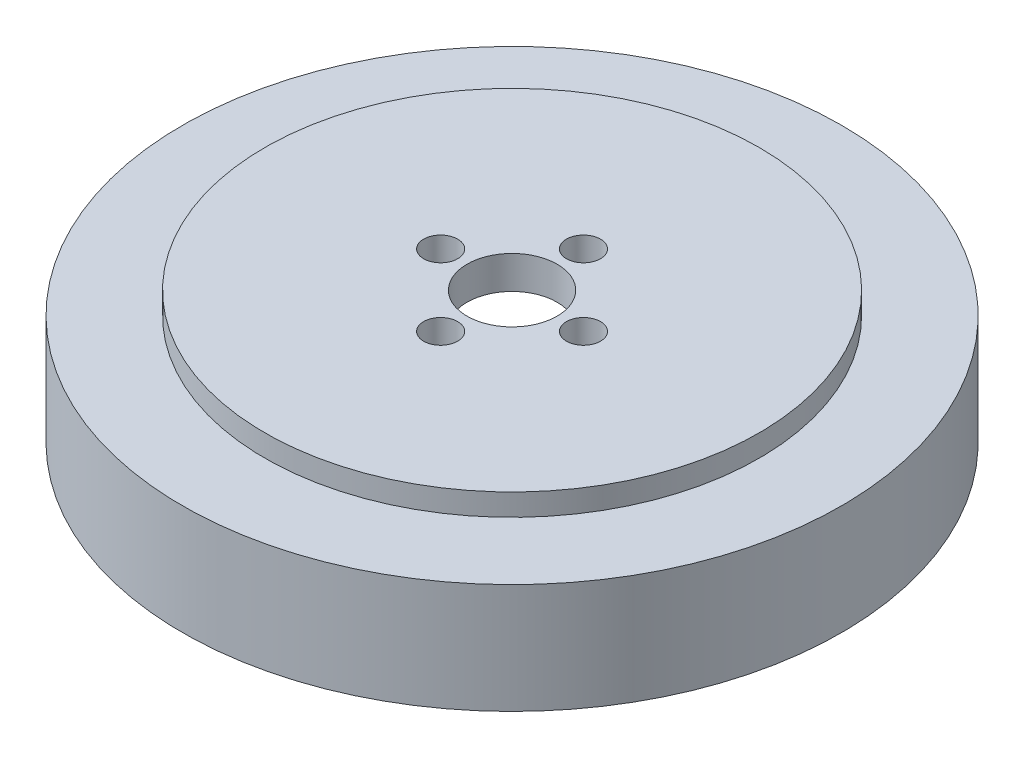
ISO-10303-21;
HEADER;
FILE_DESCRIPTION(('STEP AP214'),'2;1');
FILE_NAME('part.step','',(''),(''),'','','');
FILE_SCHEMA(('AUTOMOTIVE_DESIGN { 1 0 10303 214 1 1 1 1 }'));
ENDSEC;
DATA;
#1=APPLICATION_CONTEXT('core data for automotive mechanical design processes');
#2=APPLICATION_PROTOCOL_DEFINITION('international standard','automotive_design',2000,#1);
#3=PRODUCT_CONTEXT('',#1,'mechanical');
#4=PRODUCT('Part','Part','',(#3));
#5=PRODUCT_RELATED_PRODUCT_CATEGORY('part','',(#4));
#6=PRODUCT_DEFINITION_FORMATION('','',#4);
#7=PRODUCT_DEFINITION_CONTEXT('part definition',#1,'design');
#8=PRODUCT_DEFINITION('design','',#6,#7);
#9=PRODUCT_DEFINITION_SHAPE('','',#8);
#10=(LENGTH_UNIT() NAMED_UNIT(*) SI_UNIT(.MILLI.,.METRE.));
#11=(NAMED_UNIT(*) PLANE_ANGLE_UNIT() SI_UNIT($,.RADIAN.));
#12=(NAMED_UNIT(*) SI_UNIT($,.STERADIAN.) SOLID_ANGLE_UNIT());
#13=UNCERTAINTY_MEASURE_WITH_UNIT(LENGTH_MEASURE(1.E-05),#10,'distance_accuracy_value','');
#14=(GEOMETRIC_REPRESENTATION_CONTEXT(3) GLOBAL_UNCERTAINTY_ASSIGNED_CONTEXT((#13)) GLOBAL_UNIT_ASSIGNED_CONTEXT((#10,
#11,#12)) REPRESENTATION_CONTEXT('',''));
#15=CARTESIAN_POINT('',(0.,0.,0.));
#16=DIRECTION('',(0.,0.,1.));
#17=DIRECTION('',(1.,0.,0.));
#18=AXIS2_PLACEMENT_3D('',#15,#16,#17);
#19=CARTESIAN_POINT('',(0.,0.,0.));
#20=DIRECTION('',(0.,-1.,0.));
#21=DIRECTION('',(0.,0.,-1.));
#22=AXIS2_PLACEMENT_3D('',#19,#20,#21);
#23=CYLINDRICAL_SURFACE('',#22,22.5);
#24=CARTESIAN_POINT('',(0.,-9.00000000000001,0.));
#25=DIRECTION('',(0.,-1.,0.));
#26=DIRECTION('',(0.,0.,-1.));
#27=AXIS2_PLACEMENT_3D('',#24,#25,#26);
#28=CIRCLE('',#27,22.5);
#29=CARTESIAN_POINT('',(0.,-9.00000000000001,-22.5));
#30=VERTEX_POINT('',#29);
#31=EDGE_CURVE('E11',#30,#30,#28,.T.);
#32=ORIENTED_EDGE('',*,*,#31,.T.);
#33=EDGE_LOOP('',(#32));
#34=FACE_BOUND('',#33,.T.);
#35=CARTESIAN_POINT('',(0.,0.999999999999997,0.));
#36=DIRECTION('',(0.,-1.,0.));
#37=DIRECTION('',(0.,0.,-1.));
#38=AXIS2_PLACEMENT_3D('',#35,#36,#37);
#39=CIRCLE('',#38,22.5);
#40=CARTESIAN_POINT('',(0.,0.999999999999997,-22.5));
#41=VERTEX_POINT('',#40);
#42=EDGE_CURVE('E56',#41,#41,#39,.T.);
#43=ORIENTED_EDGE('',*,*,#42,.F.);
#44=EDGE_LOOP('',(#43));
#45=FACE_BOUND('',#44,.T.);
#46=ADVANCED_FACE('F42',(#34,#45),#23,.F.);
#47=CARTESIAN_POINT('',(22.5,-9.00000000000001,0.));
#48=DIRECTION('',(0.,-1.,0.));
#49=DIRECTION('',(0.,0.,-1.));
#50=AXIS2_PLACEMENT_3D('',#47,#48,#49);
#51=PLANE('',#50);
#52=CARTESIAN_POINT('',(0.,-9.,0.));
#53=DIRECTION('',(0.,-1.,0.));
#54=DIRECTION('',(0.,0.,-1.));
#55=AXIS2_PLACEMENT_3D('',#52,#53,#54);
#56=CIRCLE('',#55,30.);
#57=CARTESIAN_POINT('',(0.,-9.,-30.));
#58=VERTEX_POINT('',#57);
#59=EDGE_CURVE('E48',#58,#58,#56,.T.);
#60=ORIENTED_EDGE('',*,*,#59,.T.);
#61=EDGE_LOOP('',(#60));
#62=FACE_BOUND('',#61,.T.);
#63=ORIENTED_EDGE('',*,*,#31,.F.);
#64=EDGE_LOOP('',(#63));
#65=FACE_BOUND('',#64,.T.);
#66=ADVANCED_FACE('F66',(#62,#65),#51,.T.);
#67=CARTESIAN_POINT('',(0.,0.,0.));
#68=DIRECTION('',(0.,-1.,0.));
#69=DIRECTION('',(0.,0.,-1.));
#70=AXIS2_PLACEMENT_3D('',#67,#68,#69);
#71=CYLINDRICAL_SURFACE('',#70,30.);
#72=CARTESIAN_POINT('',(0.,0.999999999999997,0.));
#73=DIRECTION('',(0.,-1.,0.));
#74=DIRECTION('',(0.,0.,-1.));
#75=AXIS2_PLACEMENT_3D('',#72,#73,#74);
#76=CIRCLE('',#75,30.);
#77=CARTESIAN_POINT('',(0.,0.999999999999997,-30.));
#78=VERTEX_POINT('',#77);
#79=EDGE_CURVE('E52',#78,#78,#76,.T.);
#80=ORIENTED_EDGE('',*,*,#79,.T.);
#81=EDGE_LOOP('',(#80));
#82=FACE_BOUND('',#81,.T.);
#83=ORIENTED_EDGE('',*,*,#59,.F.);
#84=EDGE_LOOP('',(#83));
#85=FACE_BOUND('',#84,.T.);
#86=ADVANCED_FACE('F70',(#82,#85),#71,.T.);
#87=CARTESIAN_POINT('',(22.5,0.999999999999997,0.));
#88=DIRECTION('',(0.,1.,0.));
#89=DIRECTION('',(0.,0.,1.));
#90=AXIS2_PLACEMENT_3D('',#87,#88,#89);
#91=PLANE('',#90);
#92=ORIENTED_EDGE('',*,*,#42,.T.);
#93=EDGE_LOOP('',(#92));
#94=FACE_BOUND('',#93,.T.);
#95=ORIENTED_EDGE('',*,*,#79,.F.);
#96=EDGE_LOOP('',(#95));
#97=FACE_BOUND('',#96,.T.);
#98=ADVANCED_FACE('F62',(#94,#97),#91,.T.);
#99=CLOSED_SHELL('',(#46,#66,#86,#98));
#100=MANIFOLD_SOLID_BREP('B2',#99);
#101=CARTESIAN_POINT('',(21.,0.,0.));
#102=DIRECTION('',(0.,-1.,0.));
#103=DIRECTION('',(0.,0.,-1.));
#104=AXIS2_PLACEMENT_3D('',#101,#102,#103);
#105=PLANE('',#104);
#106=CARTESIAN_POINT('',(6.5,0.,0.));
#107=DIRECTION('',(0.,-1.,0.));
#108=DIRECTION('',(0.,0.,-1.));
#109=AXIS2_PLACEMENT_3D('',#106,#107,#108);
#110=CIRCLE('',#109,1.55);
#111=CARTESIAN_POINT('',(6.5,0.,-1.55));
#112=VERTEX_POINT('',#111);
#113=EDGE_CURVE('E142',#112,#112,#110,.T.);
#114=ORIENTED_EDGE('',*,*,#113,.F.);
#115=EDGE_LOOP('',(#114));
#116=FACE_BOUND('',#115,.T.);
#117=CARTESIAN_POINT('',(-6.5,0.,0.));
#118=DIRECTION('',(0.,-1.,0.));
#119=DIRECTION('',(0.,0.,-1.));
#120=AXIS2_PLACEMENT_3D('',#117,#118,#119);
#121=CIRCLE('',#120,1.55);
#122=CARTESIAN_POINT('',(-6.5,0.,-1.55));
#123=VERTEX_POINT('',#122);
#124=EDGE_CURVE('E193',#123,#123,#121,.T.);
#125=ORIENTED_EDGE('',*,*,#124,.F.);
#126=EDGE_LOOP('',(#125));
#127=FACE_BOUND('',#126,.T.);
#128=CARTESIAN_POINT('',(0.,0.,6.5));
#129=DIRECTION('',(0.,-1.,0.));
#130=DIRECTION('',(0.,0.,-1.));
#131=AXIS2_PLACEMENT_3D('',#128,#129,#130);
#132=CIRCLE('',#131,1.55);
#133=CARTESIAN_POINT('',(0.,0.,4.95));
#134=VERTEX_POINT('',#133);
#135=EDGE_CURVE('E197',#134,#134,#132,.T.);
#136=ORIENTED_EDGE('',*,*,#135,.F.);
#137=EDGE_LOOP('',(#136));
#138=FACE_BOUND('',#137,.T.);
#139=CARTESIAN_POINT('',(0.,0.,-6.5));
#140=DIRECTION('',(0.,-1.,0.));
#141=DIRECTION('',(0.,0.,-1.));
#142=AXIS2_PLACEMENT_3D('',#139,#140,#141);
#143=CIRCLE('',#142,1.55);
#144=CARTESIAN_POINT('',(0.,0.,-8.05));
#145=VERTEX_POINT('',#144);
#146=EDGE_CURVE('E161',#145,#145,#143,.T.);
#147=ORIENTED_EDGE('',*,*,#146,.F.);
#148=EDGE_LOOP('',(#147));
#149=FACE_BOUND('',#148,.T.);
#150=CARTESIAN_POINT('',(0.,0.,0.));
#151=DIRECTION('',(0.,-1.,0.));
#152=DIRECTION('',(0.,0.,-1.));
#153=AXIS2_PLACEMENT_3D('',#150,#151,#152);
#154=CIRCLE('',#153,21.);
#155=CARTESIAN_POINT('',(0.,0.,-21.));
#156=VERTEX_POINT('',#155);
#157=EDGE_CURVE('E149',#156,#156,#154,.T.);
#158=ORIENTED_EDGE('',*,*,#157,.T.);
#159=EDGE_LOOP('',(#158));
#160=FACE_BOUND('',#159,.T.);
#161=CARTESIAN_POINT('',(0.,0.,0.));
#162=DIRECTION('',(0.,-1.,0.));
#163=DIRECTION('',(0.,0.,-1.));
#164=AXIS2_PLACEMENT_3D('',#161,#162,#163);
#165=CIRCLE('',#164,4.1);
#166=CARTESIAN_POINT('',(0.,0.,-4.1));
#167=VERTEX_POINT('',#166);
#168=EDGE_CURVE('E41',#167,#167,#165,.T.);
#169=ORIENTED_EDGE('',*,*,#168,.F.);
#170=EDGE_LOOP('',(#169));
#171=FACE_BOUND('',#170,.T.);
#172=ADVANCED_FACE('F122',(#116,#127,#138,#149,#160,#171),#105,.T.);
#173=CARTESIAN_POINT('',(0.,0.,0.));
#174=DIRECTION('',(0.,-1.,0.));
#175=DIRECTION('',(0.,0.,-1.));
#176=AXIS2_PLACEMENT_3D('',#173,#174,#175);
#177=CYLINDRICAL_SURFACE('',#176,4.1);
#178=ORIENTED_EDGE('',*,*,#168,.T.);
#179=EDGE_LOOP('',(#178));
#180=FACE_BOUND('',#179,.T.);
#181=CARTESIAN_POINT('',(0.,3.,0.));
#182=DIRECTION('',(0.,-1.,0.));
#183=DIRECTION('',(0.,0.,-1.));
#184=AXIS2_PLACEMENT_3D('',#181,#182,#183);
#185=CIRCLE('',#184,4.1);
#186=CARTESIAN_POINT('',(0.,3.,-4.1));
#187=VERTEX_POINT('',#186);
#188=EDGE_CURVE('E129',#187,#187,#185,.T.);
#189=ORIENTED_EDGE('',*,*,#188,.F.);
#190=EDGE_LOOP('',(#189));
#191=FACE_BOUND('',#190,.T.);
#192=ADVANCED_FACE('F173',(#180,#191),#177,.F.);
#193=CARTESIAN_POINT('',(4.1,3.,0.));
#194=DIRECTION('',(0.,1.,0.));
#195=DIRECTION('',(0.,0.,1.));
#196=AXIS2_PLACEMENT_3D('',#193,#194,#195);
#197=PLANE('',#196);
#198=CARTESIAN_POINT('',(6.5,3.,0.));
#199=DIRECTION('',(0.,1.,0.));
#200=DIRECTION('',(0.,0.,1.));
#201=AXIS2_PLACEMENT_3D('',#198,#199,#200);
#202=CIRCLE('',#201,1.55);
#203=CARTESIAN_POINT('',(6.5,3.,1.55));
#204=VERTEX_POINT('',#203);
#205=EDGE_CURVE('E125',#204,#204,#202,.T.);
#206=ORIENTED_EDGE('',*,*,#205,.F.);
#207=EDGE_LOOP('',(#206));
#208=FACE_BOUND('',#207,.T.);
#209=CARTESIAN_POINT('',(-6.5,3.,0.));
#210=DIRECTION('',(0.,1.,0.));
#211=DIRECTION('',(0.,0.,1.));
#212=AXIS2_PLACEMENT_3D('',#209,#210,#211);
#213=CIRCLE('',#212,1.55);
#214=CARTESIAN_POINT('',(-6.5,3.,1.55));
#215=VERTEX_POINT('',#214);
#216=EDGE_CURVE('E144',#215,#215,#213,.T.);
#217=ORIENTED_EDGE('',*,*,#216,.F.);
#218=EDGE_LOOP('',(#217));
#219=FACE_BOUND('',#218,.T.);
#220=CARTESIAN_POINT('',(0.,3.,6.5));
#221=DIRECTION('',(0.,1.,0.));
#222=DIRECTION('',(0.,0.,1.));
#223=AXIS2_PLACEMENT_3D('',#220,#221,#222);
#224=CIRCLE('',#223,1.55);
#225=CARTESIAN_POINT('',(0.,3.,8.05));
#226=VERTEX_POINT('',#225);
#227=EDGE_CURVE('E141',#226,#226,#224,.T.);
#228=ORIENTED_EDGE('',*,*,#227,.F.);
#229=EDGE_LOOP('',(#228));
#230=FACE_BOUND('',#229,.T.);
#231=CARTESIAN_POINT('',(0.,3.,-6.5));
#232=DIRECTION('',(0.,1.,0.));
#233=DIRECTION('',(0.,0.,1.));
#234=AXIS2_PLACEMENT_3D('',#231,#232,#233);
#235=CIRCLE('',#234,1.55);
#236=CARTESIAN_POINT('',(0.,3.,-4.95));
#237=VERTEX_POINT('',#236);
#238=EDGE_CURVE('E138',#237,#237,#235,.T.);
#239=ORIENTED_EDGE('',*,*,#238,.F.);
#240=EDGE_LOOP('',(#239));
#241=FACE_BOUND('',#240,.T.);
#242=ORIENTED_EDGE('',*,*,#188,.T.);
#243=EDGE_LOOP('',(#242));
#244=FACE_BOUND('',#243,.T.);
#245=CARTESIAN_POINT('',(0.,3.,0.));
#246=DIRECTION('',(0.,-1.,0.));
#247=DIRECTION('',(0.,0.,-1.));
#248=AXIS2_PLACEMENT_3D('',#245,#246,#247);
#249=CIRCLE('',#248,22.5);
#250=CARTESIAN_POINT('',(0.,3.,-22.5));
#251=VERTEX_POINT('',#250);
#252=EDGE_CURVE('E134',#251,#251,#249,.T.);
#253=ORIENTED_EDGE('',*,*,#252,.F.);
#254=EDGE_LOOP('',(#253));
#255=FACE_BOUND('',#254,.T.);
#256=ADVANCED_FACE('F171',(#208,#219,#230,#241,#244,#255),#197,.T.);
#257=CARTESIAN_POINT('',(0.,0.,0.));
#258=DIRECTION('',(0.,-1.,0.));
#259=DIRECTION('',(0.,0.,-1.));
#260=AXIS2_PLACEMENT_3D('',#257,#258,#259);
#261=CYLINDRICAL_SURFACE('',#260,22.5);
#262=ORIENTED_EDGE('',*,*,#252,.T.);
#263=EDGE_LOOP('',(#262));
#264=FACE_BOUND('',#263,.T.);
#265=CARTESIAN_POINT('',(0.,-10.,0.));
#266=DIRECTION('',(0.,-1.,0.));
#267=DIRECTION('',(0.,0.,-1.));
#268=AXIS2_PLACEMENT_3D('',#265,#266,#267);
#269=CIRCLE('',#268,22.5);
#270=CARTESIAN_POINT('',(0.,-10.,-22.5));
#271=VERTEX_POINT('',#270);
#272=EDGE_CURVE('E158',#271,#271,#269,.T.);
#273=ORIENTED_EDGE('',*,*,#272,.F.);
#274=EDGE_LOOP('',(#273));
#275=FACE_BOUND('',#274,.T.);
#276=ADVANCED_FACE('F168',(#264,#275),#261,.T.);
#277=CARTESIAN_POINT('',(22.5,-10.,0.));
#278=DIRECTION('',(0.,-1.,0.));
#279=DIRECTION('',(0.,0.,-1.));
#280=AXIS2_PLACEMENT_3D('',#277,#278,#279);
#281=PLANE('',#280);
#282=ORIENTED_EDGE('',*,*,#272,.T.);
#283=EDGE_LOOP('',(#282));
#284=FACE_BOUND('',#283,.T.);
#285=CARTESIAN_POINT('',(0.,-10.,0.));
#286=DIRECTION('',(0.,-1.,0.));
#287=DIRECTION('',(0.,0.,-1.));
#288=AXIS2_PLACEMENT_3D('',#285,#286,#287);
#289=CIRCLE('',#288,21.);
#290=CARTESIAN_POINT('',(0.,-10.,-21.));
#291=VERTEX_POINT('',#290);
#292=EDGE_CURVE('E153',#291,#291,#289,.T.);
#293=ORIENTED_EDGE('',*,*,#292,.F.);
#294=EDGE_LOOP('',(#293));
#295=FACE_BOUND('',#294,.T.);
#296=ADVANCED_FACE('F180',(#284,#295),#281,.T.);
#297=CARTESIAN_POINT('',(0.,0.,0.));
#298=DIRECTION('',(0.,-1.,0.));
#299=DIRECTION('',(0.,0.,-1.));
#300=AXIS2_PLACEMENT_3D('',#297,#298,#299);
#301=CYLINDRICAL_SURFACE('',#300,21.);
#302=ORIENTED_EDGE('',*,*,#292,.T.);
#303=EDGE_LOOP('',(#302));
#304=FACE_BOUND('',#303,.T.);
#305=ORIENTED_EDGE('',*,*,#157,.F.);
#306=EDGE_LOOP('',(#305));
#307=FACE_BOUND('',#306,.T.);
#308=ADVANCED_FACE('F222',(#304,#307),#301,.F.);
#309=CARTESIAN_POINT('',(0.,10.,-6.5));
#310=DIRECTION('',(0.,-1.,0.));
#311=DIRECTION('',(0.,0.,-1.));
#312=AXIS2_PLACEMENT_3D('',#309,#310,#311);
#313=CYLINDRICAL_SURFACE('',#312,1.55);
#314=ORIENTED_EDGE('',*,*,#238,.T.);
#315=EDGE_LOOP('',(#314));
#316=FACE_BOUND('',#315,.T.);
#317=ORIENTED_EDGE('',*,*,#146,.T.);
#318=EDGE_LOOP('',(#317));
#319=FACE_BOUND('',#318,.T.);
#320=ADVANCED_FACE('F218',(#316,#319),#313,.F.);
#321=CARTESIAN_POINT('',(0.,10.,6.5));
#322=DIRECTION('',(0.,-1.,0.));
#323=DIRECTION('',(0.,0.,-1.));
#324=AXIS2_PLACEMENT_3D('',#321,#322,#323);
#325=CYLINDRICAL_SURFACE('',#324,1.55);
#326=ORIENTED_EDGE('',*,*,#227,.T.);
#327=EDGE_LOOP('',(#326));
#328=FACE_BOUND('',#327,.T.);
#329=ORIENTED_EDGE('',*,*,#135,.T.);
#330=EDGE_LOOP('',(#329));
#331=FACE_BOUND('',#330,.T.);
#332=ADVANCED_FACE('F213',(#328,#331),#325,.F.);
#333=CARTESIAN_POINT('',(-6.5,10.,0.));
#334=DIRECTION('',(0.,-1.,0.));
#335=DIRECTION('',(0.,0.,-1.));
#336=AXIS2_PLACEMENT_3D('',#333,#334,#335);
#337=CYLINDRICAL_SURFACE('',#336,1.55);
#338=ORIENTED_EDGE('',*,*,#216,.T.);
#339=EDGE_LOOP('',(#338));
#340=FACE_BOUND('',#339,.T.);
#341=ORIENTED_EDGE('',*,*,#124,.T.);
#342=EDGE_LOOP('',(#341));
#343=FACE_BOUND('',#342,.T.);
#344=ADVANCED_FACE('F208',(#340,#343),#337,.F.);
#345=CARTESIAN_POINT('',(6.5,10.,0.));
#346=DIRECTION('',(0.,-1.,0.));
#347=DIRECTION('',(0.,0.,-1.));
#348=AXIS2_PLACEMENT_3D('',#345,#346,#347);
#349=CYLINDRICAL_SURFACE('',#348,1.55);
#350=ORIENTED_EDGE('',*,*,#205,.T.);
#351=EDGE_LOOP('',(#350));
#352=FACE_BOUND('',#351,.T.);
#353=ORIENTED_EDGE('',*,*,#113,.T.);
#354=EDGE_LOOP('',(#353));
#355=FACE_BOUND('',#354,.T.);
#356=ADVANCED_FACE('F206',(#352,#355),#349,.F.);
#357=CLOSED_SHELL('',(#172,#192,#256,#276,#296,#308,#320,#332,#344,#356));
#358=MANIFOLD_SOLID_BREP('B6',#357);
#359=ADVANCED_BREP_SHAPE_REPRESENTATION('',(#18,#100,#358),#14);
#360=SHAPE_DEFINITION_REPRESENTATION(#9,#359);
ENDSEC;
END-ISO-10303-21;
